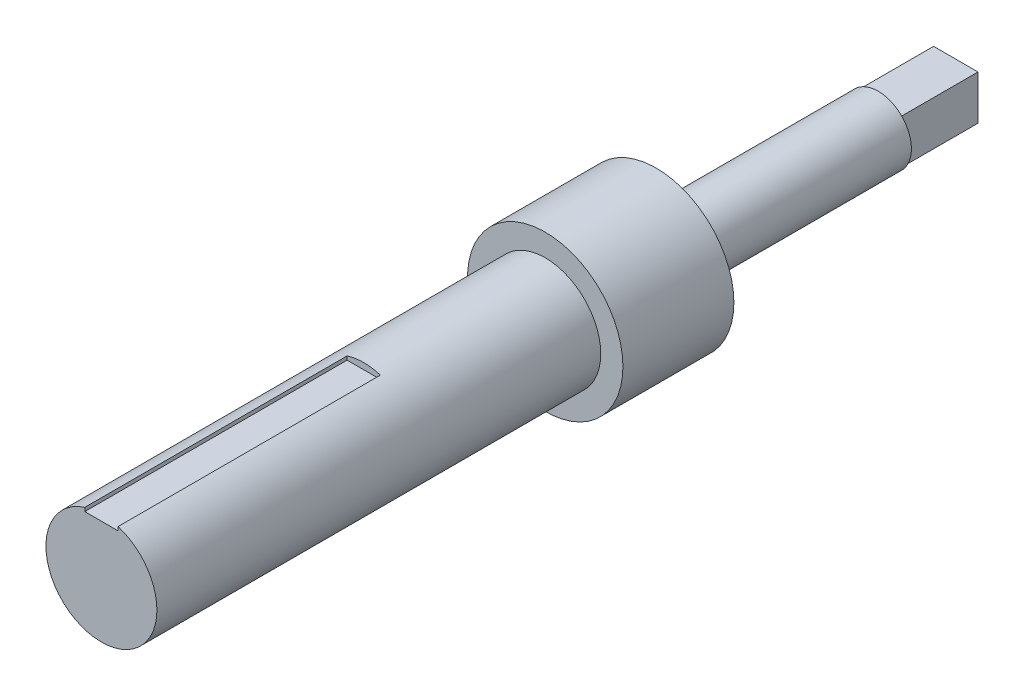
ISO-10303-21;
HEADER;
FILE_DESCRIPTION(('STEP AP214'),'2;1');
FILE_NAME('part.step','',(''),(''),'','','');
FILE_SCHEMA(('AUTOMOTIVE_DESIGN { 1 0 10303 214 1 1 1 1 }'));
ENDSEC;
DATA;
#1=APPLICATION_CONTEXT('core data for automotive mechanical design processes');
#2=APPLICATION_PROTOCOL_DEFINITION('international standard','automotive_design',2000,#1);
#3=PRODUCT_CONTEXT('',#1,'mechanical');
#4=PRODUCT('Part','Part','',(#3));
#5=PRODUCT_RELATED_PRODUCT_CATEGORY('part','',(#4));
#6=PRODUCT_DEFINITION_FORMATION('','',#4);
#7=PRODUCT_DEFINITION_CONTEXT('part definition',#1,'design');
#8=PRODUCT_DEFINITION('design','',#6,#7);
#9=PRODUCT_DEFINITION_SHAPE('','',#8);
#10=(LENGTH_UNIT() NAMED_UNIT(*) SI_UNIT(.MILLI.,.METRE.));
#11=(NAMED_UNIT(*) PLANE_ANGLE_UNIT() SI_UNIT($,.RADIAN.));
#12=(NAMED_UNIT(*) SI_UNIT($,.STERADIAN.) SOLID_ANGLE_UNIT());
#13=UNCERTAINTY_MEASURE_WITH_UNIT(LENGTH_MEASURE(1.E-05),#10,'distance_accuracy_value','');
#14=(GEOMETRIC_REPRESENTATION_CONTEXT(3) GLOBAL_UNCERTAINTY_ASSIGNED_CONTEXT((#13)) GLOBAL_UNIT_ASSIGNED_CONTEXT((#10,
#11,#12)) REPRESENTATION_CONTEXT('',''));
#15=CARTESIAN_POINT('',(0.,0.,0.));
#16=DIRECTION('',(0.,0.,1.));
#17=DIRECTION('',(1.,0.,0.));
#18=AXIS2_PLACEMENT_3D('',#15,#16,#17);
#19=CARTESIAN_POINT('',(0.,0.,25.));
#20=DIRECTION('',(0.,0.,-1.));
#21=DIRECTION('',(-1.,0.,0.));
#22=AXIS2_PLACEMENT_3D('',#19,#20,#21);
#23=CYLINDRICAL_SURFACE('',#22,3.5);
#24=CARTESIAN_POINT('',(0.,0.,0.));
#25=DIRECTION('',(0.,0.,1.));
#26=DIRECTION('',(1.,0.,0.));
#27=AXIS2_PLACEMENT_3D('',#24,#25,#26);
#28=CIRCLE('',#27,3.5);
#29=CARTESIAN_POINT('',(3.5,0.,0.));
#30=VERTEX_POINT('',#29);
#31=EDGE_CURVE('E167',#30,#30,#28,.T.);
#32=ORIENTED_EDGE('',*,*,#31,.T.);
#33=EDGE_LOOP('',(#32));
#34=FACE_BOUND('',#33,.T.);
#35=CARTESIAN_POINT('',(0.,0.,5.));
#36=DIRECTION('',(0.,0.,1.));
#37=DIRECTION('',(1.,0.,0.));
#38=AXIS2_PLACEMENT_3D('',#35,#36,#37);
#39=CIRCLE('',#38,3.5);
#40=CARTESIAN_POINT('',(3.5,0.,5.));
#41=VERTEX_POINT('',#40);
#42=EDGE_CURVE('E136',#41,#41,#39,.T.);
#43=ORIENTED_EDGE('',*,*,#42,.F.);
#44=EDGE_LOOP('',(#43));
#45=FACE_BOUND('',#44,.T.);
#46=ADVANCED_FACE('F35',(#34,#45),#23,.T.);
#47=CARTESIAN_POINT('',(0.,0.,-10.));
#48=DIRECTION('',(0.,0.,-1.));
#49=DIRECTION('',(-1.,0.,0.));
#50=AXIS2_PLACEMENT_3D('',#47,#48,#49);
#51=PLANE('',#50);
#52=CARTESIAN_POINT('',(0.,0.,-10.));
#53=DIRECTION('',(0.,0.,-1.));
#54=DIRECTION('',(-1.,0.,0.));
#55=AXIS2_PLACEMENT_3D('',#52,#53,#54);
#56=CIRCLE('',#55,1.5);
#57=CARTESIAN_POINT('',(-1.5,0.,-10.));
#58=VERTEX_POINT('',#57);
#59=EDGE_CURVE('E164',#58,#58,#56,.T.);
#60=ORIENTED_EDGE('',*,*,#59,.T.);
#61=EDGE_LOOP('',(#60));
#62=FACE_BOUND('',#61,.T.);
#63=DIRECTION('',(-1.,0.,0.));
#64=VECTOR('',#63,1.);
#65=CARTESIAN_POINT('',(0.999999999999999,-1.,-10.));
#66=LINE('',#65,#64);
#67=CARTESIAN_POINT('',(0.999999999999999,-1.,-10.));
#68=VERTEX_POINT('',#67);
#69=CARTESIAN_POINT('',(-1.,-1.,-10.));
#70=VERTEX_POINT('',#69);
#71=EDGE_CURVE('E140',#68,#70,#66,.T.);
#72=ORIENTED_EDGE('',*,*,#71,.F.);
#73=DIRECTION('',(0.,-1.,0.));
#74=VECTOR('',#73,1.);
#75=CARTESIAN_POINT('',(1.,1.,-10.));
#76=LINE('',#75,#74);
#77=CARTESIAN_POINT('',(1.,1.,-10.));
#78=VERTEX_POINT('',#77);
#79=EDGE_CURVE('E137',#78,#68,#76,.T.);
#80=ORIENTED_EDGE('',*,*,#79,.F.);
#81=DIRECTION('',(1.,0.,0.));
#82=VECTOR('',#81,1.);
#83=CARTESIAN_POINT('',(1.,1.,-10.));
#84=LINE('',#83,#82);
#85=CARTESIAN_POINT('',(-1.,1.,-10.));
#86=VERTEX_POINT('',#85);
#87=EDGE_CURVE('E144',#86,#78,#84,.T.);
#88=ORIENTED_EDGE('',*,*,#87,.F.);
#89=DIRECTION('',(0.,1.,0.));
#90=VECTOR('',#89,1.);
#91=CARTESIAN_POINT('',(-1.,1.,-10.));
#92=LINE('',#91,#90);
#93=EDGE_CURVE('E142',#70,#86,#92,.T.);
#94=ORIENTED_EDGE('',*,*,#93,.F.);
#95=EDGE_LOOP('',(#72,#80,#88,#94));
#96=FACE_BOUND('',#95,.T.);
#97=ADVANCED_FACE('F191',(#62,#96),#51,.T.);
#98=CARTESIAN_POINT('',(0.,0.,0.));
#99=DIRECTION('',(0.,0.,1.));
#100=DIRECTION('',(1.,0.,0.));
#101=AXIS2_PLACEMENT_3D('',#98,#99,#100);
#102=PLANE('',#101);
#103=ORIENTED_EDGE('',*,*,#31,.F.);
#104=EDGE_LOOP('',(#103));
#105=FACE_BOUND('',#104,.T.);
#106=CARTESIAN_POINT('',(0.,0.,0.));
#107=DIRECTION('',(0.,0.,1.));
#108=DIRECTION('',(1.,0.,0.));
#109=AXIS2_PLACEMENT_3D('',#106,#107,#108);
#110=CIRCLE('',#109,1.5);
#111=CARTESIAN_POINT('',(1.5,0.,0.));
#112=VERTEX_POINT('',#111);
#113=EDGE_CURVE('E170',#112,#112,#110,.F.);
#114=ORIENTED_EDGE('',*,*,#113,.F.);
#115=EDGE_LOOP('',(#114));
#116=FACE_BOUND('',#115,.T.);
#117=ADVANCED_FACE('F196',(#105,#116),#102,.F.);
#118=CARTESIAN_POINT('',(0.,0.,-10.));
#119=DIRECTION('',(0.,0.,1.));
#120=DIRECTION('',(1.,0.,0.));
#121=AXIS2_PLACEMENT_3D('',#118,#119,#120);
#122=CYLINDRICAL_SURFACE('',#121,1.5);
#123=ORIENTED_EDGE('',*,*,#59,.F.);
#124=EDGE_LOOP('',(#123));
#125=FACE_BOUND('',#124,.T.);
#126=ORIENTED_EDGE('',*,*,#113,.T.);
#127=EDGE_LOOP('',(#126));
#128=FACE_BOUND('',#127,.T.);
#129=ADVANCED_FACE('F231',(#125,#128),#122,.T.);
#130=CARTESIAN_POINT('',(1.,1.,-13.5));
#131=DIRECTION('',(-1.,0.,0.));
#132=DIRECTION('',(0.,-1.,0.));
#133=AXIS2_PLACEMENT_3D('',#130,#131,#132);
#134=PLANE('',#133);
#135=ORIENTED_EDGE('',*,*,#79,.T.);
#136=DIRECTION('',(0.,0.,1.));
#137=VECTOR('',#136,1.);
#138=CARTESIAN_POINT('',(0.999999999999999,-1.,-13.5));
#139=LINE('',#138,#137);
#140=CARTESIAN_POINT('',(0.999999999999999,-1.,-13.5));
#141=VERTEX_POINT('',#140);
#142=EDGE_CURVE('E162',#141,#68,#139,.T.);
#143=ORIENTED_EDGE('',*,*,#142,.F.);
#144=DIRECTION('',(0.,-1.,0.));
#145=VECTOR('',#144,1.);
#146=CARTESIAN_POINT('',(1.,1.,-13.5));
#147=LINE('',#146,#145);
#148=CARTESIAN_POINT('',(1.,1.,-13.5));
#149=VERTEX_POINT('',#148);
#150=EDGE_CURVE('E146',#149,#141,#147,.T.);
#151=ORIENTED_EDGE('',*,*,#150,.F.);
#152=DIRECTION('',(0.,0.,1.));
#153=VECTOR('',#152,1.);
#154=CARTESIAN_POINT('',(1.,1.,-13.5));
#155=LINE('',#154,#153);
#156=EDGE_CURVE('E155',#149,#78,#155,.T.);
#157=ORIENTED_EDGE('',*,*,#156,.T.);
#158=EDGE_LOOP('',(#135,#143,#151,#157));
#159=FACE_BOUND('',#158,.T.);
#160=ADVANCED_FACE('F228',(#159),#134,.F.);
#161=CARTESIAN_POINT('',(0.999999999999999,-1.,-13.5));
#162=DIRECTION('',(0.,1.,0.));
#163=DIRECTION('',(-1.,0.,0.));
#164=AXIS2_PLACEMENT_3D('',#161,#162,#163);
#165=PLANE('',#164);
#166=ORIENTED_EDGE('',*,*,#71,.T.);
#167=DIRECTION('',(0.,0.,1.));
#168=VECTOR('',#167,1.);
#169=CARTESIAN_POINT('',(-1.,-1.,-13.5));
#170=LINE('',#169,#168);
#171=CARTESIAN_POINT('',(-1.,-1.,-13.5));
#172=VERTEX_POINT('',#171);
#173=EDGE_CURVE('E159',#172,#70,#170,.T.);
#174=ORIENTED_EDGE('',*,*,#173,.F.);
#175=DIRECTION('',(-1.,0.,0.));
#176=VECTOR('',#175,1.);
#177=CARTESIAN_POINT('',(0.999999999999999,-1.,-13.5));
#178=LINE('',#177,#176);
#179=EDGE_CURVE('E149',#141,#172,#178,.T.);
#180=ORIENTED_EDGE('',*,*,#179,.F.);
#181=ORIENTED_EDGE('',*,*,#142,.T.);
#182=EDGE_LOOP('',(#166,#174,#180,#181));
#183=FACE_BOUND('',#182,.T.);
#184=ADVANCED_FACE('F224',(#183),#165,.F.);
#185=CARTESIAN_POINT('',(-1.,1.,-13.5));
#186=DIRECTION('',(1.,0.,0.));
#187=DIRECTION('',(0.,0.,-1.));
#188=AXIS2_PLACEMENT_3D('',#185,#186,#187);
#189=PLANE('',#188);
#190=ORIENTED_EDGE('',*,*,#93,.T.);
#191=DIRECTION('',(0.,0.,1.));
#192=VECTOR('',#191,1.);
#193=CARTESIAN_POINT('',(-1.,1.,-13.5));
#194=LINE('',#193,#192);
#195=CARTESIAN_POINT('',(-1.,1.,-13.5));
#196=VERTEX_POINT('',#195);
#197=EDGE_CURVE('E57',#196,#86,#194,.T.);
#198=ORIENTED_EDGE('',*,*,#197,.F.);
#199=DIRECTION('',(0.,1.,0.));
#200=VECTOR('',#199,1.);
#201=CARTESIAN_POINT('',(-1.,1.,-13.5));
#202=LINE('',#201,#200);
#203=EDGE_CURVE('E151',#172,#196,#202,.T.);
#204=ORIENTED_EDGE('',*,*,#203,.F.);
#205=ORIENTED_EDGE('',*,*,#173,.T.);
#206=EDGE_LOOP('',(#190,#198,#204,#205));
#207=FACE_BOUND('',#206,.T.);
#208=ADVANCED_FACE('F221',(#207),#189,.F.);
#209=CARTESIAN_POINT('',(1.,1.,-13.5));
#210=DIRECTION('',(0.,-1.,0.));
#211=DIRECTION('',(0.,0.,-1.));
#212=AXIS2_PLACEMENT_3D('',#209,#210,#211);
#213=PLANE('',#212);
#214=ORIENTED_EDGE('',*,*,#87,.T.);
#215=ORIENTED_EDGE('',*,*,#156,.F.);
#216=DIRECTION('',(1.,0.,0.));
#217=VECTOR('',#216,1.);
#218=CARTESIAN_POINT('',(1.,1.,-13.5));
#219=LINE('',#218,#217);
#220=EDGE_CURVE('E153',#196,#149,#219,.T.);
#221=ORIENTED_EDGE('',*,*,#220,.F.);
#222=ORIENTED_EDGE('',*,*,#197,.T.);
#223=EDGE_LOOP('',(#214,#215,#221,#222));
#224=FACE_BOUND('',#223,.T.);
#225=ADVANCED_FACE('F213',(#224),#213,.F.);
#226=CARTESIAN_POINT('',(0.999999999999999,-1.,-13.5));
#227=DIRECTION('',(0.,0.,-1.));
#228=DIRECTION('',(-1.,0.,0.));
#229=AXIS2_PLACEMENT_3D('',#226,#227,#228);
#230=PLANE('',#229);
#231=ORIENTED_EDGE('',*,*,#150,.T.);
#232=ORIENTED_EDGE('',*,*,#179,.T.);
#233=ORIENTED_EDGE('',*,*,#203,.T.);
#234=ORIENTED_EDGE('',*,*,#220,.T.);
#235=EDGE_LOOP('',(#231,#232,#233,#234));
#236=FACE_BOUND('',#235,.T.);
#237=ADVANCED_FACE('F205',(#236),#230,.T.);
#238=CARTESIAN_POINT('',(0.,0.,5.));
#239=DIRECTION('',(0.,0.,1.));
#240=DIRECTION('',(1.,0.,0.));
#241=AXIS2_PLACEMENT_3D('',#238,#239,#240);
#242=PLANE('',#241);
#243=CARTESIAN_POINT('',(0.,0.,5.));
#244=DIRECTION('',(0.,0.,1.));
#245=DIRECTION('',(1.,0.,0.));
#246=AXIS2_PLACEMENT_3D('',#243,#244,#245);
#247=CIRCLE('',#246,2.5);
#248=CARTESIAN_POINT('',(2.5,0.,5.));
#249=VERTEX_POINT('',#248);
#250=EDGE_CURVE('E133',#249,#249,#247,.T.);
#251=ORIENTED_EDGE('',*,*,#250,.F.);
#252=EDGE_LOOP('',(#251));
#253=FACE_BOUND('',#252,.T.);
#254=ORIENTED_EDGE('',*,*,#42,.T.);
#255=EDGE_LOOP('',(#254));
#256=FACE_BOUND('',#255,.T.);
#257=ADVANCED_FACE('F203',(#253,#256),#242,.T.);
#258=CARTESIAN_POINT('',(0.,0.,5.));
#259=DIRECTION('',(0.,0.,1.));
#260=DIRECTION('',(1.,0.,0.));
#261=AXIS2_PLACEMENT_3D('',#258,#259,#260);
#262=CYLINDRICAL_SURFACE('',#261,2.5);
#263=DIRECTION('',(0.,0.,1.));
#264=VECTOR('',#263,1.);
#265=CARTESIAN_POINT('',(-0.75,2.38484800354236,5.));
#266=LINE('',#265,#264);
#267=CARTESIAN_POINT('',(-0.75,2.38484800354236,13.1798800337435));
#268=VERTEX_POINT('',#267);
#269=CARTESIAN_POINT('',(-0.75,2.38484800354236,25.));
#270=VERTEX_POINT('',#269);
#271=EDGE_CURVE('E130',#268,#270,#266,.T.);
#272=ORIENTED_EDGE('',*,*,#271,.F.);
#273=CARTESIAN_POINT('',(0.,0.,13.1798800337435));
#274=DIRECTION('',(0.,0.,1.));
#275=DIRECTION('',(1.,0.,0.));
#276=AXIS2_PLACEMENT_3D('',#273,#274,#275);
#277=CIRCLE('',#276,2.5);
#278=CARTESIAN_POINT('',(0.75,2.38484800354236,13.1798800337435));
#279=VERTEX_POINT('',#278);
#280=EDGE_CURVE('E12',#268,#279,#277,.F.);
#281=ORIENTED_EDGE('',*,*,#280,.T.);
#282=DIRECTION('',(0.,0.,1.));
#283=VECTOR('',#282,1.);
#284=CARTESIAN_POINT('',(0.75,2.38484800354236,5.));
#285=LINE('',#284,#283);
#286=CARTESIAN_POINT('',(0.75,2.38484800354236,25.));
#287=VERTEX_POINT('',#286);
#288=EDGE_CURVE('E109',#287,#279,#285,.F.);
#289=ORIENTED_EDGE('',*,*,#288,.F.);
#290=CARTESIAN_POINT('',(0.,0.,25.));
#291=DIRECTION('',(0.,0.,1.));
#292=DIRECTION('',(1.,0.,0.));
#293=AXIS2_PLACEMENT_3D('',#290,#291,#292);
#294=CIRCLE('',#293,2.5);
#295=EDGE_CURVE('E120',#270,#287,#294,.T.);
#296=ORIENTED_EDGE('',*,*,#295,.F.);
#297=EDGE_LOOP('',(#272,#281,#289,#296));
#298=FACE_BOUND('',#297,.T.);
#299=ORIENTED_EDGE('',*,*,#250,.T.);
#300=EDGE_LOOP('',(#299));
#301=FACE_BOUND('',#300,.T.);
#302=ADVANCED_FACE('F179',(#298,#301),#262,.T.);
#303=CARTESIAN_POINT('',(0.,0.,25.));
#304=DIRECTION('',(0.,0.,1.));
#305=DIRECTION('',(1.,0.,0.));
#306=AXIS2_PLACEMENT_3D('',#303,#304,#305);
#307=PLANE('',#306);
#308=DIRECTION('',(0.,-1.,0.));
#309=VECTOR('',#308,1.);
#310=CARTESIAN_POINT('',(-0.749999999999999,0.,25.));
#311=LINE('',#310,#309);
#312=CARTESIAN_POINT('',(-0.75,2.21757373090923,25.));
#313=VERTEX_POINT('',#312);
#314=EDGE_CURVE('E42',#270,#313,#311,.T.);
#315=ORIENTED_EDGE('',*,*,#314,.F.);
#316=ORIENTED_EDGE('',*,*,#295,.T.);
#317=DIRECTION('',(0.,1.,0.));
#318=VECTOR('',#317,1.);
#319=CARTESIAN_POINT('',(0.75,2.76468558545468,25.));
#320=LINE('',#319,#318);
#321=CARTESIAN_POINT('',(0.75,2.21757373090923,25.));
#322=VERTEX_POINT('',#321);
#323=EDGE_CURVE('E104',#322,#287,#320,.T.);
#324=ORIENTED_EDGE('',*,*,#323,.F.);
#325=DIRECTION('',(1.,0.,0.));
#326=VECTOR('',#325,1.);
#327=CARTESIAN_POINT('',(-0.75,2.21757373090923,25.));
#328=LINE('',#327,#326);
#329=EDGE_CURVE('E112',#313,#322,#328,.T.);
#330=ORIENTED_EDGE('',*,*,#329,.F.);
#331=EDGE_LOOP('',(#315,#316,#324,#330));
#332=FACE_BOUND('',#331,.T.);
#333=ADVANCED_FACE('F118',(#332),#307,.T.);
#334=CARTESIAN_POINT('',(-0.75,2.76468558545468,13.1798800337435));
#335=DIRECTION('',(-1.,0.,0.));
#336=DIRECTION('',(0.,-1.,0.));
#337=AXIS2_PLACEMENT_3D('',#334,#335,#336);
#338=PLANE('',#337);
#339=ORIENTED_EDGE('',*,*,#271,.T.);
#340=ORIENTED_EDGE('',*,*,#314,.T.);
#341=DIRECTION('',(0.,0.,1.));
#342=VECTOR('',#341,1.);
#343=CARTESIAN_POINT('',(-0.75,2.21757373090923,13.1798800337435));
#344=LINE('',#343,#342);
#345=CARTESIAN_POINT('',(-0.75,2.21757373090923,13.1798800337435));
#346=VERTEX_POINT('',#345);
#347=EDGE_CURVE('E49',#346,#313,#344,.T.);
#348=ORIENTED_EDGE('',*,*,#347,.F.);
#349=DIRECTION('',(0.,-1.,0.));
#350=VECTOR('',#349,1.);
#351=CARTESIAN_POINT('',(-0.75,2.76468558545468,13.1798800337435));
#352=LINE('',#351,#350);
#353=EDGE_CURVE('E121',#268,#346,#352,.T.);
#354=ORIENTED_EDGE('',*,*,#353,.F.);
#355=EDGE_LOOP('',(#339,#340,#348,#354));
#356=FACE_BOUND('',#355,.T.);
#357=ADVANCED_FACE('F175',(#356),#338,.F.);
#358=CARTESIAN_POINT('',(0.75,2.76468558545468,13.1798800337435));
#359=DIRECTION('',(1.,0.,0.));
#360=DIRECTION('',(0.,1.,0.));
#361=AXIS2_PLACEMENT_3D('',#358,#359,#360);
#362=PLANE('',#361);
#363=ORIENTED_EDGE('',*,*,#288,.T.);
#364=DIRECTION('',(0.,1.,0.));
#365=VECTOR('',#364,1.);
#366=CARTESIAN_POINT('',(0.75,2.76468558545468,13.1798800337435));
#367=LINE('',#366,#365);
#368=CARTESIAN_POINT('',(0.75,2.21757373090923,13.1798800337435));
#369=VERTEX_POINT('',#368);
#370=EDGE_CURVE('E107',#369,#279,#367,.T.);
#371=ORIENTED_EDGE('',*,*,#370,.F.);
#372=DIRECTION('',(0.,0.,1.));
#373=VECTOR('',#372,1.);
#374=CARTESIAN_POINT('',(0.75,2.21757373090923,13.1798800337435));
#375=LINE('',#374,#373);
#376=EDGE_CURVE('E101',#369,#322,#375,.T.);
#377=ORIENTED_EDGE('',*,*,#376,.T.);
#378=ORIENTED_EDGE('',*,*,#323,.T.);
#379=EDGE_LOOP('',(#363,#371,#377,#378));
#380=FACE_BOUND('',#379,.T.);
#381=ADVANCED_FACE('F102',(#380),#362,.F.);
#382=CARTESIAN_POINT('',(-0.75,2.21757373090923,13.1798800337435));
#383=DIRECTION('',(0.,-1.,0.));
#384=DIRECTION('',(0.,0.,-1.));
#385=AXIS2_PLACEMENT_3D('',#382,#383,#384);
#386=PLANE('',#385);
#387=ORIENTED_EDGE('',*,*,#329,.T.);
#388=ORIENTED_EDGE('',*,*,#376,.F.);
#389=DIRECTION('',(1.,0.,0.));
#390=VECTOR('',#389,1.);
#391=CARTESIAN_POINT('',(-0.75,2.21757373090923,13.1798800337435));
#392=LINE('',#391,#390);
#393=EDGE_CURVE('E123',#346,#369,#392,.T.);
#394=ORIENTED_EDGE('',*,*,#393,.F.);
#395=ORIENTED_EDGE('',*,*,#347,.T.);
#396=EDGE_LOOP('',(#387,#388,#394,#395));
#397=FACE_BOUND('',#396,.T.);
#398=ADVANCED_FACE('F113',(#397),#386,.F.);
#399=CARTESIAN_POINT('',(-0.75,2.21757373090923,13.1798800337435));
#400=DIRECTION('',(0.,0.,1.));
#401=DIRECTION('',(1.,0.,0.));
#402=AXIS2_PLACEMENT_3D('',#399,#400,#401);
#403=PLANE('',#402);
#404=ORIENTED_EDGE('',*,*,#353,.T.);
#405=ORIENTED_EDGE('',*,*,#393,.T.);
#406=ORIENTED_EDGE('',*,*,#370,.T.);
#407=ORIENTED_EDGE('',*,*,#280,.F.);
#408=EDGE_LOOP('',(#404,#405,#406,#407));
#409=FACE_BOUND('',#408,.T.);
#410=ADVANCED_FACE('F182',(#409),#403,.T.);
#411=CLOSED_SHELL('',(#46,#97,#117,#129,#160,#184,#208,#225,#237,#257,#302,#333,#357,#381,#398,#410));
#412=MANIFOLD_SOLID_BREP('B2',#411);
#413=ADVANCED_BREP_SHAPE_REPRESENTATION('',(#18,#412),#14);
#414=SHAPE_DEFINITION_REPRESENTATION(#9,#413);
ENDSEC;
END-ISO-10303-21;
